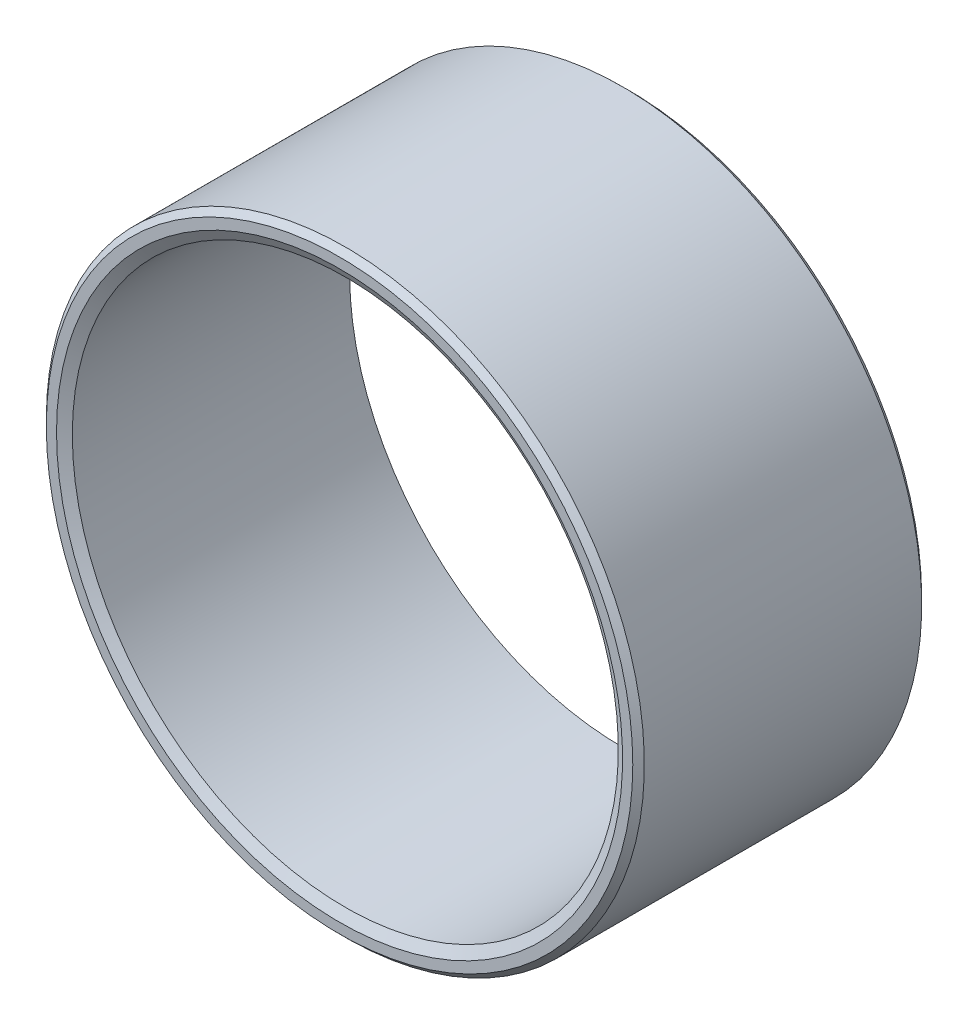
ISO-10303-21;
HEADER;
FILE_DESCRIPTION(('STEP AP214'),'2;1');
FILE_NAME('part.step','',(''),(''),'','','');
FILE_SCHEMA(('AUTOMOTIVE_DESIGN { 1 0 10303 214 1 1 1 1 }'));
ENDSEC;
DATA;
#1=APPLICATION_CONTEXT('core data for automotive mechanical design processes');
#2=APPLICATION_PROTOCOL_DEFINITION('international standard','automotive_design',2000,#1);
#3=PRODUCT_CONTEXT('',#1,'mechanical');
#4=PRODUCT('Part','Part','',(#3));
#5=PRODUCT_RELATED_PRODUCT_CATEGORY('part','',(#4));
#6=PRODUCT_DEFINITION_FORMATION('','',#4);
#7=PRODUCT_DEFINITION_CONTEXT('part definition',#1,'design');
#8=PRODUCT_DEFINITION('design','',#6,#7);
#9=PRODUCT_DEFINITION_SHAPE('','',#8);
#10=(LENGTH_UNIT() NAMED_UNIT(*) SI_UNIT(.MILLI.,.METRE.));
#11=(NAMED_UNIT(*) PLANE_ANGLE_UNIT() SI_UNIT($,.RADIAN.));
#12=(NAMED_UNIT(*) SI_UNIT($,.STERADIAN.) SOLID_ANGLE_UNIT());
#13=UNCERTAINTY_MEASURE_WITH_UNIT(LENGTH_MEASURE(1.E-05),#10,'distance_accuracy_value','');
#14=(GEOMETRIC_REPRESENTATION_CONTEXT(3) GLOBAL_UNCERTAINTY_ASSIGNED_CONTEXT((#13)) GLOBAL_UNIT_ASSIGNED_CONTEXT((#10,
#11,#12)) REPRESENTATION_CONTEXT('',''));
#15=CARTESIAN_POINT('',(0.,0.,0.));
#16=DIRECTION('',(0.,0.,1.));
#17=DIRECTION('',(1.,0.,0.));
#18=AXIS2_PLACEMENT_3D('',#15,#16,#17);
#19=CARTESIAN_POINT('',(0.,0.,-0.254));
#20=DIRECTION('',(0.,0.,-1.));
#21=DIRECTION('',(-1.,0.,0.));
#22=AXIS2_PLACEMENT_3D('',#19,#20,#21);
#23=CONICAL_SURFACE('',#22,13.1445,0.78539816339745);
#24=CARTESIAN_POINT('',(0.,0.,0.));
#25=DIRECTION('',(0.,0.,-1.));
#26=DIRECTION('',(-1.,0.,0.));
#27=AXIS2_PLACEMENT_3D('',#24,#25,#26);
#28=CIRCLE('',#27,12.8905);
#29=CARTESIAN_POINT('',(-12.8905,0.,0.));
#30=VERTEX_POINT('',#29);
#31=EDGE_CURVE('E59',#30,#30,#28,.T.);
#32=ORIENTED_EDGE('',*,*,#31,.T.);
#33=EDGE_LOOP('',(#32));
#34=FACE_BOUND('',#33,.T.);
#35=CARTESIAN_POINT('',(0.,0.,-0.254));
#36=DIRECTION('',(0.,0.,-1.));
#37=DIRECTION('',(-1.,0.,0.));
#38=AXIS2_PLACEMENT_3D('',#35,#36,#37);
#39=CIRCLE('',#38,13.1445);
#40=CARTESIAN_POINT('',(-13.1445,0.,-0.254));
#41=VERTEX_POINT('',#40);
#42=EDGE_CURVE('E10',#41,#41,#39,.T.);
#43=ORIENTED_EDGE('',*,*,#42,.F.);
#44=EDGE_LOOP('',(#43));
#45=FACE_BOUND('',#44,.T.);
#46=ADVANCED_FACE('F31',(#34,#45),#23,.T.);
#47=CARTESIAN_POINT('',(0.,0.,0.));
#48=DIRECTION('',(0.,0.,-1.));
#49=DIRECTION('',(-1.,0.,0.));
#50=AXIS2_PLACEMENT_3D('',#47,#48,#49);
#51=CYLINDRICAL_SURFACE('',#50,13.1445);
#52=ORIENTED_EDGE('',*,*,#42,.T.);
#53=EDGE_LOOP('',(#52));
#54=FACE_BOUND('',#53,.T.);
#55=CARTESIAN_POINT('',(0.,0.,-12.446));
#56=DIRECTION('',(0.,0.,-1.));
#57=DIRECTION('',(-1.,0.,0.));
#58=AXIS2_PLACEMENT_3D('',#55,#56,#57);
#59=CIRCLE('',#58,13.1445);
#60=CARTESIAN_POINT('',(-13.1445,0.,-12.446));
#61=VERTEX_POINT('',#60);
#62=EDGE_CURVE('E37',#61,#61,#59,.T.);
#63=ORIENTED_EDGE('',*,*,#62,.F.);
#64=EDGE_LOOP('',(#63));
#65=FACE_BOUND('',#64,.T.);
#66=ADVANCED_FACE('F77',(#54,#65),#51,.T.);
#67=CARTESIAN_POINT('',(0.,0.,-12.7));
#68=DIRECTION('',(0.,0.,1.));
#69=DIRECTION('',(1.,0.,0.));
#70=AXIS2_PLACEMENT_3D('',#67,#68,#69);
#71=CONICAL_SURFACE('',#70,12.8905,0.785398163397445);
#72=ORIENTED_EDGE('',*,*,#62,.T.);
#73=EDGE_LOOP('',(#72));
#74=FACE_BOUND('',#73,.T.);
#75=CARTESIAN_POINT('',(0.,0.,-12.7));
#76=DIRECTION('',(0.,0.,-1.));
#77=DIRECTION('',(-1.,0.,0.));
#78=AXIS2_PLACEMENT_3D('',#75,#76,#77);
#79=CIRCLE('',#78,12.8905);
#80=CARTESIAN_POINT('',(-12.8905,0.,-12.7));
#81=VERTEX_POINT('',#80);
#82=EDGE_CURVE('E41',#81,#81,#79,.T.);
#83=ORIENTED_EDGE('',*,*,#82,.F.);
#84=EDGE_LOOP('',(#83));
#85=FACE_BOUND('',#84,.T.);
#86=ADVANCED_FACE('F81',(#74,#85),#71,.T.);
#87=CARTESIAN_POINT('',(12.4414409051225,0.,-12.7));
#88=DIRECTION('',(0.,0.,-1.));
#89=DIRECTION('',(-1.,0.,0.));
#90=AXIS2_PLACEMENT_3D('',#87,#88,#89);
#91=PLANE('',#90);
#92=ORIENTED_EDGE('',*,*,#82,.T.);
#93=EDGE_LOOP('',(#92));
#94=FACE_BOUND('',#93,.T.);
#95=CARTESIAN_POINT('',(0.,0.,-12.7));
#96=DIRECTION('',(0.,0.,-1.));
#97=DIRECTION('',(-1.,0.,0.));
#98=AXIS2_PLACEMENT_3D('',#95,#96,#97);
#99=CIRCLE('',#98,12.4414409051225);
#100=CARTESIAN_POINT('',(-12.4414409051225,0.,-12.7));
#101=VERTEX_POINT('',#100);
#102=EDGE_CURVE('E45',#101,#101,#99,.T.);
#103=ORIENTED_EDGE('',*,*,#102,.F.);
#104=EDGE_LOOP('',(#103));
#105=FACE_BOUND('',#104,.T.);
#106=ADVANCED_FACE('F85',(#94,#105),#91,.T.);
#107=CARTESIAN_POINT('',(0.,0.,-12.446));
#108=DIRECTION('',(0.,0.,-1.));
#109=DIRECTION('',(-1.,0.,0.));
#110=AXIS2_PLACEMENT_3D('',#107,#108,#109);
#111=CONICAL_SURFACE('',#110,12.0015,1.04719755119659);
#112=ORIENTED_EDGE('',*,*,#102,.T.);
#113=EDGE_LOOP('',(#112));
#114=FACE_BOUND('',#113,.T.);
#115=CARTESIAN_POINT('',(0.,0.,-12.446));
#116=DIRECTION('',(0.,0.,-1.));
#117=DIRECTION('',(-1.,0.,0.));
#118=AXIS2_PLACEMENT_3D('',#115,#116,#117);
#119=CIRCLE('',#118,12.0015);
#120=CARTESIAN_POINT('',(-12.0015,0.,-12.446));
#121=VERTEX_POINT('',#120);
#122=EDGE_CURVE('E50',#121,#121,#119,.T.);
#123=ORIENTED_EDGE('',*,*,#122,.F.);
#124=EDGE_LOOP('',(#123));
#125=FACE_BOUND('',#124,.T.);
#126=ADVANCED_FACE('F91',(#114,#125),#111,.F.);
#127=CARTESIAN_POINT('',(0.,0.,0.));
#128=DIRECTION('',(0.,0.,-1.));
#129=DIRECTION('',(-1.,0.,0.));
#130=AXIS2_PLACEMENT_3D('',#127,#128,#129);
#131=CYLINDRICAL_SURFACE('',#130,12.0015);
#132=ORIENTED_EDGE('',*,*,#122,.T.);
#133=EDGE_LOOP('',(#132));
#134=FACE_BOUND('',#133,.T.);
#135=CARTESIAN_POINT('',(0.,0.,-0.254));
#136=DIRECTION('',(0.,0.,-1.));
#137=DIRECTION('',(-1.,0.,0.));
#138=AXIS2_PLACEMENT_3D('',#135,#136,#137);
#139=CIRCLE('',#138,12.0015);
#140=CARTESIAN_POINT('',(-12.0015,0.,-0.254));
#141=VERTEX_POINT('',#140);
#142=EDGE_CURVE('E53',#141,#141,#139,.T.);
#143=ORIENTED_EDGE('',*,*,#142,.F.);
#144=EDGE_LOOP('',(#143));
#145=FACE_BOUND('',#144,.T.);
#146=ADVANCED_FACE('F73',(#134,#145),#131,.F.);
#147=CARTESIAN_POINT('',(0.,0.,0.));
#148=DIRECTION('',(0.,0.,1.));
#149=DIRECTION('',(1.,0.,0.));
#150=AXIS2_PLACEMENT_3D('',#147,#148,#149);
#151=CONICAL_SURFACE('',#150,12.4414409051225,1.04719755119659);
#152=ORIENTED_EDGE('',*,*,#142,.T.);
#153=EDGE_LOOP('',(#152));
#154=FACE_BOUND('',#153,.T.);
#155=CARTESIAN_POINT('',(0.,0.,0.));
#156=DIRECTION('',(0.,0.,-1.));
#157=DIRECTION('',(-1.,0.,0.));
#158=AXIS2_PLACEMENT_3D('',#155,#156,#157);
#159=CIRCLE('',#158,12.4414409051225);
#160=CARTESIAN_POINT('',(-12.4414409051225,0.,0.));
#161=VERTEX_POINT('',#160);
#162=EDGE_CURVE('E56',#161,#161,#159,.T.);
#163=ORIENTED_EDGE('',*,*,#162,.F.);
#164=EDGE_LOOP('',(#163));
#165=FACE_BOUND('',#164,.T.);
#166=ADVANCED_FACE('F67',(#154,#165),#151,.F.);
#167=CARTESIAN_POINT('',(12.8905,0.,0.));
#168=DIRECTION('',(0.,0.,1.));
#169=DIRECTION('',(1.,0.,0.));
#170=AXIS2_PLACEMENT_3D('',#167,#168,#169);
#171=PLANE('',#170);
#172=ORIENTED_EDGE('',*,*,#162,.T.);
#173=EDGE_LOOP('',(#172));
#174=FACE_BOUND('',#173,.T.);
#175=ORIENTED_EDGE('',*,*,#31,.F.);
#176=EDGE_LOOP('',(#175));
#177=FACE_BOUND('',#176,.T.);
#178=ADVANCED_FACE('F65',(#174,#177),#171,.T.);
#179=CLOSED_SHELL('',(#46,#66,#86,#106,#126,#146,#166,#178));
#180=MANIFOLD_SOLID_BREP('B2',#179);
#181=ADVANCED_BREP_SHAPE_REPRESENTATION('',(#18,#180),#14);
#182=SHAPE_DEFINITION_REPRESENTATION(#9,#181);
ENDSEC;
END-ISO-10303-21;
